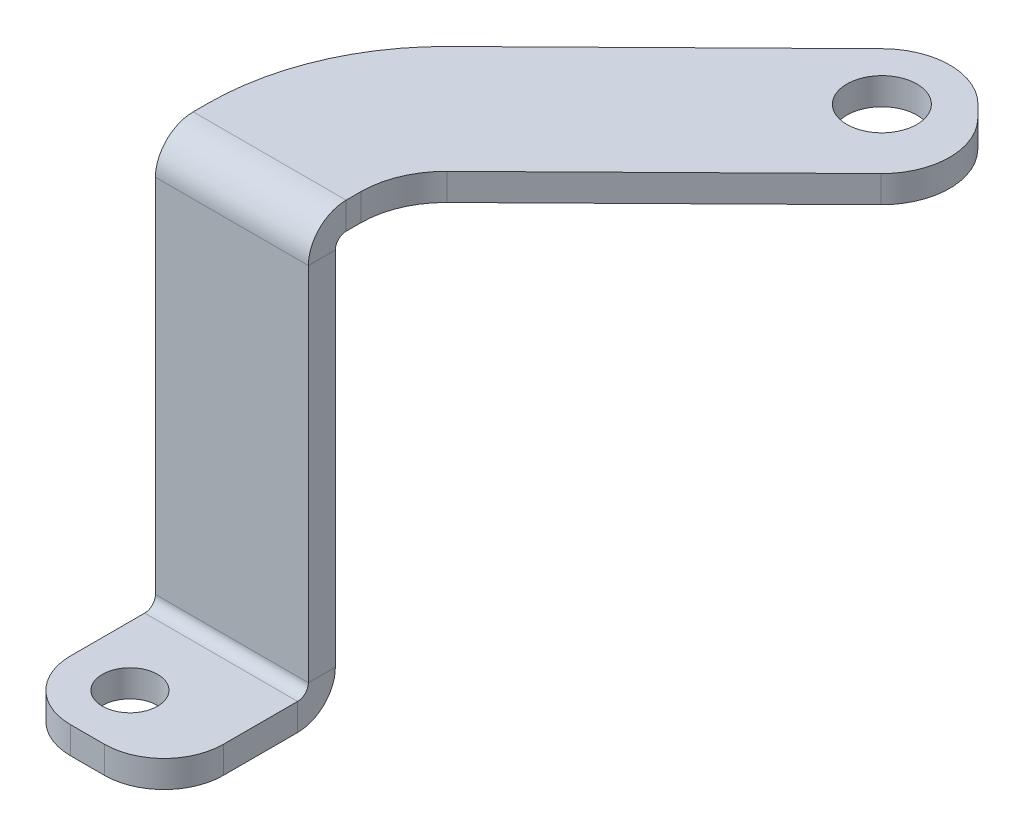
ISO-10303-21;
HEADER;
FILE_DESCRIPTION(('STEP AP214'),'2;1');
FILE_NAME('part.step','',(''),(''),'','','');
FILE_SCHEMA(('AUTOMOTIVE_DESIGN { 1 0 10303 214 1 1 1 1 }'));
ENDSEC;
DATA;
#1=APPLICATION_CONTEXT('core data for automotive mechanical design processes');
#2=APPLICATION_PROTOCOL_DEFINITION('international standard','automotive_design',2000,#1);
#3=PRODUCT_CONTEXT('',#1,'mechanical');
#4=PRODUCT('Part','Part','',(#3));
#5=PRODUCT_RELATED_PRODUCT_CATEGORY('part','',(#4));
#6=PRODUCT_DEFINITION_FORMATION('','',#4);
#7=PRODUCT_DEFINITION_CONTEXT('part definition',#1,'design');
#8=PRODUCT_DEFINITION('design','',#6,#7);
#9=PRODUCT_DEFINITION_SHAPE('','',#8);
#10=(LENGTH_UNIT() NAMED_UNIT(*) SI_UNIT(.MILLI.,.METRE.));
#11=(NAMED_UNIT(*) PLANE_ANGLE_UNIT() SI_UNIT($,.RADIAN.));
#12=(NAMED_UNIT(*) SI_UNIT($,.STERADIAN.) SOLID_ANGLE_UNIT());
#13=UNCERTAINTY_MEASURE_WITH_UNIT(LENGTH_MEASURE(1.E-05),#10,'distance_accuracy_value','');
#14=(GEOMETRIC_REPRESENTATION_CONTEXT(3) GLOBAL_UNCERTAINTY_ASSIGNED_CONTEXT((#13)) GLOBAL_UNIT_ASSIGNED_CONTEXT((#10,
#11,#12)) REPRESENTATION_CONTEXT('',''));
#15=CARTESIAN_POINT('',(0.,0.,0.));
#16=DIRECTION('',(0.,0.,1.));
#17=DIRECTION('',(1.,0.,0.));
#18=AXIS2_PLACEMENT_3D('',#15,#16,#17);
#19=CARTESIAN_POINT('',(11.,0.,-13.175));
#20=DIRECTION('',(-1.,0.,0.));
#21=DIRECTION('',(0.,0.,1.));
#22=AXIS2_PLACEMENT_3D('',#19,#20,#21);
#23=PLANE('',#22);
#24=DIRECTION('',(0.,0.,1.));
#25=VECTOR('',#24,1.);
#26=CARTESIAN_POINT('',(11.,43.7924999999999,-13.1750000000001));
#27=LINE('',#26,#25);
#28=CARTESIAN_POINT('',(11.,43.7924999999999,-13.1750000000001));
#29=VERTEX_POINT('',#28);
#30=CARTESIAN_POINT('',(11.,43.7924999999999,-10.0000000000001));
#31=VERTEX_POINT('',#30);
#32=EDGE_CURVE('E284',#29,#31,#27,.T.);
#33=ORIENTED_EDGE('',*,*,#32,.T.);
#34=DIRECTION('',(0.,-1.,0.));
#35=VECTOR('',#34,1.);
#36=CARTESIAN_POINT('',(11.,0.,-10.));
#37=LINE('',#36,#35);
#38=CARTESIAN_POINT('',(11.,1.26999999999998,-10.));
#39=VERTEX_POINT('',#38);
#40=EDGE_CURVE('E309',#31,#39,#37,.T.);
#41=ORIENTED_EDGE('',*,*,#40,.T.);
#42=DIRECTION('',(0.,0.,-1.));
#43=VECTOR('',#42,1.);
#44=CARTESIAN_POINT('',(11.,1.27,-10.));
#45=LINE('',#44,#43);
#46=CARTESIAN_POINT('',(11.,1.26999999999997,-13.175));
#47=VERTEX_POINT('',#46);
#48=EDGE_CURVE('E296',#39,#47,#45,.T.);
#49=ORIENTED_EDGE('',*,*,#48,.T.);
#50=DIRECTION('',(0.,-1.,0.));
#51=VECTOR('',#50,1.);
#52=CARTESIAN_POINT('',(11.,0.,-13.175));
#53=LINE('',#52,#51);
#54=EDGE_CURVE('E310',#29,#47,#53,.T.);
#55=ORIENTED_EDGE('',*,*,#54,.F.);
#56=EDGE_LOOP('',(#33,#41,#49,#55));
#57=FACE_BOUND('',#56,.T.);
#58=ADVANCED_FACE('F43',(#57),#23,.F.);
#59=CARTESIAN_POINT('',(-6.99999999999999,45.0624999999999,-13.1750000000002));
#60=DIRECTION('',(1.,0.,0.));
#61=DIRECTION('',(0.,1.,0.));
#62=AXIS2_PLACEMENT_3D('',#59,#60,#61);
#63=PLANE('',#62);
#64=DIRECTION('',(0.,0.,1.));
#65=VECTOR('',#64,1.);
#66=CARTESIAN_POINT('',(-6.99999999999999,43.7924999999999,-13.1750000000001));
#67=LINE('',#66,#65);
#68=CARTESIAN_POINT('',(-6.99999999999999,43.7924999999999,-13.1750000000001));
#69=VERTEX_POINT('',#68);
#70=CARTESIAN_POINT('',(-6.99999999999999,43.7924999999999,-10.0000000000002));
#71=VERTEX_POINT('',#70);
#72=EDGE_CURVE('E294',#69,#71,#67,.T.);
#73=ORIENTED_EDGE('',*,*,#72,.F.);
#74=DIRECTION('',(0.,1.,0.));
#75=VECTOR('',#74,1.);
#76=CARTESIAN_POINT('',(-6.99999999999999,45.0624999999999,-13.1750000000002));
#77=LINE('',#76,#75);
#78=CARTESIAN_POINT('',(-7.,1.27000000000002,-13.175));
#79=VERTEX_POINT('',#78);
#80=EDGE_CURVE('E312',#79,#69,#77,.T.);
#81=ORIENTED_EDGE('',*,*,#80,.F.);
#82=DIRECTION('',(0.,0.,-1.));
#83=VECTOR('',#82,1.);
#84=CARTESIAN_POINT('',(-7.,1.27,-10.));
#85=LINE('',#84,#83);
#86=CARTESIAN_POINT('',(-7.,1.26999999999998,-10.));
#87=VERTEX_POINT('',#86);
#88=EDGE_CURVE('E301',#87,#79,#85,.T.);
#89=ORIENTED_EDGE('',*,*,#88,.F.);
#90=DIRECTION('',(0.,1.,0.));
#91=VECTOR('',#90,1.);
#92=CARTESIAN_POINT('',(-6.99999999999999,45.0624999999999,-10.0000000000002));
#93=LINE('',#92,#91);
#94=EDGE_CURVE('E313',#87,#71,#93,.T.);
#95=ORIENTED_EDGE('',*,*,#94,.T.);
#96=EDGE_LOOP('',(#73,#81,#89,#95));
#97=FACE_BOUND('',#96,.T.);
#98=ADVANCED_FACE('F417',(#97),#63,.F.);
#99=CARTESIAN_POINT('',(0.,0.,-13.175));
#100=DIRECTION('',(0.,0.,1.));
#101=DIRECTION('',(0.,-1.,0.));
#102=AXIS2_PLACEMENT_3D('',#99,#100,#101);
#103=PLANE('',#102);
#104=DIRECTION('',(1.,0.,0.));
#105=VECTOR('',#104,1.);
#106=CARTESIAN_POINT('',(11.,43.7924999999999,-13.1750000000001));
#107=LINE('',#106,#105);
#108=EDGE_CURVE('E290',#29,#69,#107,.F.);
#109=ORIENTED_EDGE('',*,*,#108,.F.);
#110=ORIENTED_EDGE('',*,*,#54,.T.);
#111=DIRECTION('',(1.,0.,0.));
#112=VECTOR('',#111,1.);
#113=CARTESIAN_POINT('',(0.,1.27000000000002,-13.175));
#114=LINE('',#113,#112);
#115=EDGE_CURVE('E304',#79,#47,#114,.T.);
#116=ORIENTED_EDGE('',*,*,#115,.F.);
#117=ORIENTED_EDGE('',*,*,#80,.T.);
#118=EDGE_LOOP('',(#109,#110,#116,#117));
#119=FACE_BOUND('',#118,.T.);
#120=ADVANCED_FACE('F420',(#119),#103,.F.);
#121=CARTESIAN_POINT('',(0.,0.,-10.));
#122=DIRECTION('',(0.,0.,1.));
#123=DIRECTION('',(0.,-1.,0.));
#124=AXIS2_PLACEMENT_3D('',#121,#122,#123);
#125=PLANE('',#124);
#126=ORIENTED_EDGE('',*,*,#40,.F.);
#127=DIRECTION('',(1.,0.,0.));
#128=VECTOR('',#127,1.);
#129=CARTESIAN_POINT('',(11.,43.7924999999999,-10.0000000000001));
#130=LINE('',#129,#128);
#131=EDGE_CURVE('E279',#31,#71,#130,.F.);
#132=ORIENTED_EDGE('',*,*,#131,.T.);
#133=ORIENTED_EDGE('',*,*,#94,.F.);
#134=DIRECTION('',(-1.,0.,0.));
#135=VECTOR('',#134,1.);
#136=CARTESIAN_POINT('',(11.,1.27,-10.));
#137=LINE('',#136,#135);
#138=EDGE_CURVE('E299',#39,#87,#137,.T.);
#139=ORIENTED_EDGE('',*,*,#138,.F.);
#140=EDGE_LOOP('',(#126,#132,#133,#139));
#141=FACE_BOUND('',#140,.T.);
#142=ADVANCED_FACE('F408',(#141),#125,.T.);
#143=CARTESIAN_POINT('',(-7.,-3.175,-10.));
#144=DIRECTION('',(-1.,0.,0.));
#145=DIRECTION('',(0.,0.,1.));
#146=AXIS2_PLACEMENT_3D('',#143,#144,#145);
#147=PLANE('',#146);
#148=DIRECTION('',(0.,0.,1.));
#149=VECTOR('',#148,1.);
#150=CARTESIAN_POINT('',(-7.,0.,-10.));
#151=LINE('',#150,#149);
#152=CARTESIAN_POINT('',(-7.,0.,-8.73000000000001));
#153=VERTEX_POINT('',#152);
#154=CARTESIAN_POINT('',(-7.,0.,0.));
#155=VERTEX_POINT('',#154);
#156=EDGE_CURVE('E344',#153,#155,#151,.T.);
#157=ORIENTED_EDGE('',*,*,#156,.F.);
#158=DIRECTION('',(0.,-1.,0.));
#159=VECTOR('',#158,1.);
#160=CARTESIAN_POINT('',(-7.,0.,-8.73000000000001));
#161=LINE('',#160,#159);
#162=CARTESIAN_POINT('',(-7.,-3.17500000000002,-8.73000000000001));
#163=VERTEX_POINT('',#162);
#164=EDGE_CURVE('E326',#153,#163,#161,.T.);
#165=ORIENTED_EDGE('',*,*,#164,.T.);
#166=DIRECTION('',(0.,0.,1.));
#167=VECTOR('',#166,1.);
#168=CARTESIAN_POINT('',(-7.,-3.175,-10.));
#169=LINE('',#168,#167);
#170=CARTESIAN_POINT('',(-7.,-3.175,0.));
#171=VERTEX_POINT('',#170);
#172=EDGE_CURVE('E347',#163,#171,#169,.T.);
#173=ORIENTED_EDGE('',*,*,#172,.T.);
#174=DIRECTION('',(0.,1.,0.));
#175=VECTOR('',#174,1.);
#176=CARTESIAN_POINT('',(-7.,-3.175,0.));
#177=LINE('',#176,#175);
#178=EDGE_CURVE('E47',#171,#155,#177,.T.);
#179=ORIENTED_EDGE('',*,*,#178,.T.);
#180=EDGE_LOOP('',(#157,#165,#173,#179));
#181=FACE_BOUND('',#180,.T.);
#182=ADVANCED_FACE('F45',(#181),#147,.T.);
#183=CARTESIAN_POINT('',(0.,-3.175,0.));
#184=DIRECTION('',(0.,1.,0.));
#185=DIRECTION('',(0.,0.,1.));
#186=AXIS2_PLACEMENT_3D('',#183,#184,#185);
#187=PLANE('',#186);
#188=CARTESIAN_POINT('',(0.,-3.175,0.));
#189=DIRECTION('',(0.,1.,0.));
#190=DIRECTION('',(0.,0.,1.));
#191=AXIS2_PLACEMENT_3D('',#188,#189,#190);
#192=CIRCLE('',#191,3.25);
#193=CARTESIAN_POINT('',(0.,-3.175,3.25));
#194=VERTEX_POINT('',#193);
#195=EDGE_CURVE('E341',#194,#194,#192,.T.);
#196=ORIENTED_EDGE('',*,*,#195,.T.);
#197=EDGE_LOOP('',(#196));
#198=FACE_BOUND('',#197,.T.);
#199=DIRECTION('',(-1.,0.,0.));
#200=VECTOR('',#199,1.);
#201=CARTESIAN_POINT('',(-7.,-3.17500000000002,-8.73000000000001));
#202=LINE('',#201,#200);
#203=CARTESIAN_POINT('',(11.,-3.175,-8.73000000000001));
#204=VERTEX_POINT('',#203);
#205=EDGE_CURVE('E320',#163,#204,#202,.F.);
#206=ORIENTED_EDGE('',*,*,#205,.T.);
#207=DIRECTION('',(0.,0.,-1.));
#208=VECTOR('',#207,1.);
#209=CARTESIAN_POINT('',(11.,-3.175,0.));
#210=LINE('',#209,#208);
#211=CARTESIAN_POINT('',(11.,-3.175,0.));
#212=VERTEX_POINT('',#211);
#213=EDGE_CURVE('E359',#212,#204,#210,.T.);
#214=ORIENTED_EDGE('',*,*,#213,.F.);
#215=CARTESIAN_POINT('',(4.,-3.175,0.));
#216=DIRECTION('',(0.,1.,0.));
#217=DIRECTION('',(0.,0.,1.));
#218=AXIS2_PLACEMENT_3D('',#215,#216,#217);
#219=CIRCLE('',#218,7.);
#220=CARTESIAN_POINT('',(4.,-3.175,7.));
#221=VERTEX_POINT('',#220);
#222=EDGE_CURVE('E356',#221,#212,#219,.T.);
#223=ORIENTED_EDGE('',*,*,#222,.F.);
#224=DIRECTION('',(1.,0.,0.));
#225=VECTOR('',#224,1.);
#226=CARTESIAN_POINT('',(0.,-3.175,7.));
#227=LINE('',#226,#225);
#228=CARTESIAN_POINT('',(0.,-3.175,7.));
#229=VERTEX_POINT('',#228);
#230=EDGE_CURVE('E353',#229,#221,#227,.T.);
#231=ORIENTED_EDGE('',*,*,#230,.F.);
#232=CARTESIAN_POINT('',(0.,-3.175,0.));
#233=DIRECTION('',(0.,1.,0.));
#234=DIRECTION('',(0.,0.,1.));
#235=AXIS2_PLACEMENT_3D('',#232,#233,#234);
#236=CIRCLE('',#235,7.);
#237=EDGE_CURVE('E349',#171,#229,#236,.T.);
#238=ORIENTED_EDGE('',*,*,#237,.F.);
#239=ORIENTED_EDGE('',*,*,#172,.F.);
#240=EDGE_LOOP('',(#206,#214,#223,#231,#238,#239));
#241=FACE_BOUND('',#240,.T.);
#242=ADVANCED_FACE('F425',(#198,#241),#187,.F.);
#243=CARTESIAN_POINT('',(0.,0.,0.));
#244=DIRECTION('',(0.,1.,0.));
#245=DIRECTION('',(0.,0.,1.));
#246=AXIS2_PLACEMENT_3D('',#243,#244,#245);
#247=PLANE('',#246);
#248=CARTESIAN_POINT('',(0.,0.,0.));
#249=DIRECTION('',(0.,1.,0.));
#250=DIRECTION('',(0.,0.,1.));
#251=AXIS2_PLACEMENT_3D('',#248,#249,#250);
#252=CIRCLE('',#251,3.25);
#253=CARTESIAN_POINT('',(0.,0.,3.25));
#254=VERTEX_POINT('',#253);
#255=EDGE_CURVE('E338',#254,#254,#252,.T.);
#256=ORIENTED_EDGE('',*,*,#255,.F.);
#257=EDGE_LOOP('',(#256));
#258=FACE_BOUND('',#257,.T.);
#259=DIRECTION('',(0.,0.,-1.));
#260=VECTOR('',#259,1.);
#261=CARTESIAN_POINT('',(11.,0.,0.));
#262=LINE('',#261,#260);
#263=CARTESIAN_POINT('',(11.,0.,0.));
#264=VERTEX_POINT('',#263);
#265=CARTESIAN_POINT('',(11.,0.,-8.73000000000001));
#266=VERTEX_POINT('',#265);
#267=EDGE_CURVE('E350',#264,#266,#262,.T.);
#268=ORIENTED_EDGE('',*,*,#267,.T.);
#269=DIRECTION('',(-1.,0.,0.));
#270=VECTOR('',#269,1.);
#271=CARTESIAN_POINT('',(-7.,0.,-8.73000000000001));
#272=LINE('',#271,#270);
#273=EDGE_CURVE('E68',#153,#266,#272,.F.);
#274=ORIENTED_EDGE('',*,*,#273,.F.);
#275=ORIENTED_EDGE('',*,*,#156,.T.);
#276=CARTESIAN_POINT('',(0.,0.,0.));
#277=DIRECTION('',(0.,1.,0.));
#278=DIRECTION('',(0.,0.,1.));
#279=AXIS2_PLACEMENT_3D('',#276,#277,#278);
#280=CIRCLE('',#279,7.);
#281=CARTESIAN_POINT('',(0.,0.,7.));
#282=VERTEX_POINT('',#281);
#283=EDGE_CURVE('E363',#155,#282,#280,.T.);
#284=ORIENTED_EDGE('',*,*,#283,.T.);
#285=DIRECTION('',(1.,0.,0.));
#286=VECTOR('',#285,1.);
#287=CARTESIAN_POINT('',(0.,0.,7.));
#288=LINE('',#287,#286);
#289=CARTESIAN_POINT('',(4.,0.,7.));
#290=VERTEX_POINT('',#289);
#291=EDGE_CURVE('E366',#282,#290,#288,.T.);
#292=ORIENTED_EDGE('',*,*,#291,.T.);
#293=CARTESIAN_POINT('',(4.,0.,0.));
#294=DIRECTION('',(0.,1.,0.));
#295=DIRECTION('',(0.,0.,1.));
#296=AXIS2_PLACEMENT_3D('',#293,#294,#295);
#297=CIRCLE('',#296,7.);
#298=EDGE_CURVE('E369',#290,#264,#297,.T.);
#299=ORIENTED_EDGE('',*,*,#298,.T.);
#300=EDGE_LOOP('',(#268,#274,#275,#284,#292,#299));
#301=FACE_BOUND('',#300,.T.);
#302=ADVANCED_FACE('F383',(#258,#301),#247,.T.);
#303=CARTESIAN_POINT('',(11.,-3.175,0.));
#304=DIRECTION('',(1.,0.,0.));
#305=DIRECTION('',(0.,0.,-1.));
#306=AXIS2_PLACEMENT_3D('',#303,#304,#305);
#307=PLANE('',#306);
#308=DIRECTION('',(0.,-1.,0.));
#309=VECTOR('',#308,1.);
#310=CARTESIAN_POINT('',(11.,0.,-8.73000000000001));
#311=LINE('',#310,#309);
#312=EDGE_CURVE('E335',#266,#204,#311,.T.);
#313=ORIENTED_EDGE('',*,*,#312,.F.);
#314=ORIENTED_EDGE('',*,*,#267,.F.);
#315=DIRECTION('',(0.,1.,0.));
#316=VECTOR('',#315,1.);
#317=CARTESIAN_POINT('',(11.,-3.175,0.));
#318=LINE('',#317,#316);
#319=EDGE_CURVE('E11',#212,#264,#318,.T.);
#320=ORIENTED_EDGE('',*,*,#319,.F.);
#321=ORIENTED_EDGE('',*,*,#213,.T.);
#322=EDGE_LOOP('',(#313,#314,#320,#321));
#323=FACE_BOUND('',#322,.T.);
#324=ADVANCED_FACE('F394',(#323),#307,.T.);
#325=CARTESIAN_POINT('',(4.,-3.175,0.));
#326=DIRECTION('',(0.,1.,0.));
#327=DIRECTION('',(0.,0.,1.));
#328=AXIS2_PLACEMENT_3D('',#325,#326,#327);
#329=CYLINDRICAL_SURFACE('',#328,7.);
#330=ORIENTED_EDGE('',*,*,#298,.F.);
#331=DIRECTION('',(0.,1.,0.));
#332=VECTOR('',#331,1.);
#333=CARTESIAN_POINT('',(4.,-3.175,7.));
#334=LINE('',#333,#332);
#335=EDGE_CURVE('E52',#221,#290,#334,.T.);
#336=ORIENTED_EDGE('',*,*,#335,.F.);
#337=ORIENTED_EDGE('',*,*,#222,.T.);
#338=ORIENTED_EDGE('',*,*,#319,.T.);
#339=EDGE_LOOP('',(#330,#336,#337,#338));
#340=FACE_BOUND('',#339,.T.);
#341=ADVANCED_FACE('F391',(#340),#329,.T.);
#342=CARTESIAN_POINT('',(0.,-3.175,7.));
#343=DIRECTION('',(0.,0.,1.));
#344=DIRECTION('',(1.,0.,0.));
#345=AXIS2_PLACEMENT_3D('',#342,#343,#344);
#346=PLANE('',#345);
#347=ORIENTED_EDGE('',*,*,#291,.F.);
#348=DIRECTION('',(0.,1.,0.));
#349=VECTOR('',#348,1.);
#350=CARTESIAN_POINT('',(0.,-3.175,7.));
#351=LINE('',#350,#349);
#352=EDGE_CURVE('E373',#229,#282,#351,.T.);
#353=ORIENTED_EDGE('',*,*,#352,.F.);
#354=ORIENTED_EDGE('',*,*,#230,.T.);
#355=ORIENTED_EDGE('',*,*,#335,.T.);
#356=EDGE_LOOP('',(#347,#353,#354,#355));
#357=FACE_BOUND('',#356,.T.);
#358=ADVANCED_FACE('F387',(#357),#346,.T.);
#359=CARTESIAN_POINT('',(0.,-3.175,0.));
#360=DIRECTION('',(0.,1.,0.));
#361=DIRECTION('',(0.,0.,1.));
#362=AXIS2_PLACEMENT_3D('',#359,#360,#361);
#363=CYLINDRICAL_SURFACE('',#362,7.);
#364=ORIENTED_EDGE('',*,*,#283,.F.);
#365=ORIENTED_EDGE('',*,*,#178,.F.);
#366=ORIENTED_EDGE('',*,*,#237,.T.);
#367=ORIENTED_EDGE('',*,*,#352,.T.);
#368=EDGE_LOOP('',(#364,#365,#366,#367));
#369=FACE_BOUND('',#368,.T.);
#370=ADVANCED_FACE('F382',(#369),#363,.T.);
#371=CARTESIAN_POINT('',(0.,-3.175,0.));
#372=DIRECTION('',(0.,1.,0.));
#373=DIRECTION('',(0.,0.,1.));
#374=AXIS2_PLACEMENT_3D('',#371,#372,#373);
#375=CYLINDRICAL_SURFACE('',#374,3.25);
#376=ORIENTED_EDGE('',*,*,#195,.F.);
#377=EDGE_LOOP('',(#376));
#378=FACE_BOUND('',#377,.T.);
#379=ORIENTED_EDGE('',*,*,#255,.T.);
#380=EDGE_LOOP('',(#379));
#381=FACE_BOUND('',#380,.T.);
#382=ADVANCED_FACE('F451',(#378,#381),#375,.F.);
#383=CARTESIAN_POINT('',(11.,1.26999999999999,-8.73000000000001));
#384=DIRECTION('',(1.,0.,0.));
#385=DIRECTION('',(0.,0.,-1.));
#386=AXIS2_PLACEMENT_3D('',#383,#384,#385);
#387=PLANE('',#386);
#388=ORIENTED_EDGE('',*,*,#48,.F.);
#389=CARTESIAN_POINT('',(11.,1.26999999999999,-8.73000000000001));
#390=DIRECTION('',(-1.,0.,0.));
#391=DIRECTION('',(0.,0.,1.));
#392=AXIS2_PLACEMENT_3D('',#389,#390,#391);
#393=CIRCLE('',#392,1.27);
#394=EDGE_CURVE('E329',#266,#39,#393,.F.);
#395=ORIENTED_EDGE('',*,*,#394,.F.);
#396=ORIENTED_EDGE('',*,*,#312,.T.);
#397=CARTESIAN_POINT('',(11.,1.26999999999999,-8.73000000000001));
#398=DIRECTION('',(-1.,0.,0.));
#399=DIRECTION('',(0.,0.,1.));
#400=AXIS2_PLACEMENT_3D('',#397,#398,#399);
#401=CIRCLE('',#400,4.445);
#402=EDGE_CURVE('E322',#204,#47,#401,.F.);
#403=ORIENTED_EDGE('',*,*,#402,.T.);
#404=EDGE_LOOP('',(#388,#395,#396,#403));
#405=FACE_BOUND('',#404,.T.);
#406=ADVANCED_FACE('F402',(#405),#387,.T.);
#407=CARTESIAN_POINT('',(-7.,1.26999999999999,-8.73000000000001));
#408=DIRECTION('',(1.,0.,0.));
#409=DIRECTION('',(0.,0.,-1.));
#410=AXIS2_PLACEMENT_3D('',#407,#408,#409);
#411=PLANE('',#410);
#412=CARTESIAN_POINT('',(-7.,1.26999999999999,-8.73000000000001));
#413=DIRECTION('',(-1.,0.,0.));
#414=DIRECTION('',(0.,0.,1.));
#415=AXIS2_PLACEMENT_3D('',#412,#413,#414);
#416=CIRCLE('',#415,1.27);
#417=EDGE_CURVE('E316',#87,#153,#416,.T.);
#418=ORIENTED_EDGE('',*,*,#417,.F.);
#419=ORIENTED_EDGE('',*,*,#88,.T.);
#420=CARTESIAN_POINT('',(-7.,1.26999999999999,-8.73000000000001));
#421=DIRECTION('',(-1.,0.,0.));
#422=DIRECTION('',(0.,0.,1.));
#423=AXIS2_PLACEMENT_3D('',#420,#421,#422);
#424=CIRCLE('',#423,4.445);
#425=EDGE_CURVE('E323',#79,#163,#424,.T.);
#426=ORIENTED_EDGE('',*,*,#425,.T.);
#427=ORIENTED_EDGE('',*,*,#164,.F.);
#428=EDGE_LOOP('',(#418,#419,#426,#427));
#429=FACE_BOUND('',#428,.T.);
#430=ADVANCED_FACE('F412',(#429),#411,.F.);
#431=CARTESIAN_POINT('',(-7.,1.26999999999999,-8.73000000000001));
#432=DIRECTION('',(-1.,0.,0.));
#433=DIRECTION('',(0.,0.,-1.));
#434=AXIS2_PLACEMENT_3D('',#431,#432,#433);
#435=CYLINDRICAL_SURFACE('',#434,4.445);
#436=ORIENTED_EDGE('',*,*,#205,.F.);
#437=ORIENTED_EDGE('',*,*,#425,.F.);
#438=ORIENTED_EDGE('',*,*,#115,.T.);
#439=ORIENTED_EDGE('',*,*,#402,.F.);
#440=EDGE_LOOP('',(#436,#437,#438,#439));
#441=FACE_BOUND('',#440,.T.);
#442=ADVANCED_FACE('F423',(#441),#435,.T.);
#443=CARTESIAN_POINT('',(-7.,1.26999999999999,-8.73000000000001));
#444=DIRECTION('',(-1.,0.,0.));
#445=DIRECTION('',(0.,0.,-1.));
#446=AXIS2_PLACEMENT_3D('',#443,#444,#445);
#447=CYLINDRICAL_SURFACE('',#446,1.27);
#448=ORIENTED_EDGE('',*,*,#273,.T.);
#449=ORIENTED_EDGE('',*,*,#394,.T.);
#450=ORIENTED_EDGE('',*,*,#138,.T.);
#451=ORIENTED_EDGE('',*,*,#417,.T.);
#452=EDGE_LOOP('',(#448,#449,#450,#451));
#453=FACE_BOUND('',#452,.T.);
#454=ADVANCED_FACE('F397',(#453),#447,.F.);
#455=CARTESIAN_POINT('',(-6.99999999999999,43.7924999999999,-14.4450000000001));
#456=DIRECTION('',(-1.,0.,0.));
#457=DIRECTION('',(0.,0.,1.));
#458=AXIS2_PLACEMENT_3D('',#455,#456,#457);
#459=PLANE('',#458);
#460=DIRECTION('',(0.,1.,0.));
#461=VECTOR('',#460,1.);
#462=CARTESIAN_POINT('',(-7.,45.0624999999999,-14.4450000000001));
#463=LINE('',#462,#461);
#464=CARTESIAN_POINT('',(-6.99999999999999,45.0624999999999,-14.4450000000001));
#465=VERTEX_POINT('',#464);
#466=CARTESIAN_POINT('',(-6.99999999999999,48.2374999999999,-14.4450000000001));
#467=VERTEX_POINT('',#466);
#468=EDGE_CURVE('E248',#465,#467,#463,.T.);
#469=ORIENTED_EDGE('',*,*,#468,.F.);
#470=CARTESIAN_POINT('',(-6.99999999999999,43.7924999999999,-14.4450000000001));
#471=DIRECTION('',(1.,0.,0.));
#472=DIRECTION('',(0.,0.,-1.));
#473=AXIS2_PLACEMENT_3D('',#470,#471,#472);
#474=CIRCLE('',#473,1.27);
#475=EDGE_CURVE('E287',#69,#465,#474,.F.);
#476=ORIENTED_EDGE('',*,*,#475,.F.);
#477=ORIENTED_EDGE('',*,*,#72,.T.);
#478=CARTESIAN_POINT('',(-6.99999999999999,43.7924999999999,-14.4450000000001));
#479=DIRECTION('',(1.,0.,0.));
#480=DIRECTION('',(0.,0.,-1.));
#481=AXIS2_PLACEMENT_3D('',#478,#479,#480);
#482=CIRCLE('',#481,4.445);
#483=EDGE_CURVE('E60',#71,#467,#482,.F.);
#484=ORIENTED_EDGE('',*,*,#483,.T.);
#485=EDGE_LOOP('',(#469,#476,#477,#484));
#486=FACE_BOUND('',#485,.T.);
#487=ADVANCED_FACE('F448',(#486),#459,.T.);
#488=CARTESIAN_POINT('',(11.,43.7924999999999,-14.4450000000001));
#489=DIRECTION('',(-1.,0.,0.));
#490=DIRECTION('',(0.,0.,1.));
#491=AXIS2_PLACEMENT_3D('',#488,#489,#490);
#492=PLANE('',#491);
#493=CARTESIAN_POINT('',(11.,43.7924999999999,-14.4450000000001));
#494=DIRECTION('',(1.,0.,0.));
#495=DIRECTION('',(0.,0.,-1.));
#496=AXIS2_PLACEMENT_3D('',#493,#494,#495);
#497=CIRCLE('',#496,1.27);
#498=CARTESIAN_POINT('',(11.,45.0624999999999,-14.4450000000001));
#499=VERTEX_POINT('',#498);
#500=EDGE_CURVE('E278',#499,#29,#497,.T.);
#501=ORIENTED_EDGE('',*,*,#500,.F.);
#502=DIRECTION('',(0.,1.,0.));
#503=VECTOR('',#502,1.);
#504=CARTESIAN_POINT('',(11.,45.0624999999999,-14.4450000000001));
#505=LINE('',#504,#503);
#506=CARTESIAN_POINT('',(11.,48.2374999999999,-14.4450000000001));
#507=VERTEX_POINT('',#506);
#508=EDGE_CURVE('E258',#499,#507,#505,.T.);
#509=ORIENTED_EDGE('',*,*,#508,.T.);
#510=CARTESIAN_POINT('',(11.,43.7924999999999,-14.4450000000001));
#511=DIRECTION('',(1.,0.,0.));
#512=DIRECTION('',(0.,0.,-1.));
#513=AXIS2_PLACEMENT_3D('',#510,#511,#512);
#514=CIRCLE('',#513,4.445);
#515=EDGE_CURVE('E282',#507,#31,#514,.T.);
#516=ORIENTED_EDGE('',*,*,#515,.T.);
#517=ORIENTED_EDGE('',*,*,#32,.F.);
#518=EDGE_LOOP('',(#501,#509,#516,#517));
#519=FACE_BOUND('',#518,.T.);
#520=ADVANCED_FACE('F532',(#519),#492,.F.);
#521=CARTESIAN_POINT('',(11.,43.7924999999999,-14.4450000000001));
#522=DIRECTION('',(1.,0.,0.));
#523=DIRECTION('',(0.,1.,0.));
#524=AXIS2_PLACEMENT_3D('',#521,#522,#523);
#525=CYLINDRICAL_SURFACE('',#524,4.445);
#526=ORIENTED_EDGE('',*,*,#131,.F.);
#527=ORIENTED_EDGE('',*,*,#515,.F.);
#528=DIRECTION('',(-1.,0.,0.));
#529=VECTOR('',#528,1.);
#530=CARTESIAN_POINT('',(0.,48.2374999999999,-14.4450000000001));
#531=LINE('',#530,#529);
#532=EDGE_CURVE('E261',#507,#467,#531,.T.);
#533=ORIENTED_EDGE('',*,*,#532,.T.);
#534=ORIENTED_EDGE('',*,*,#483,.F.);
#535=EDGE_LOOP('',(#526,#527,#533,#534));
#536=FACE_BOUND('',#535,.T.);
#537=ADVANCED_FACE('F543',(#536),#525,.T.);
#538=CARTESIAN_POINT('',(11.,43.7924999999999,-14.4450000000001));
#539=DIRECTION('',(1.,0.,0.));
#540=DIRECTION('',(0.,1.,0.));
#541=AXIS2_PLACEMENT_3D('',#538,#539,#540);
#542=CYLINDRICAL_SURFACE('',#541,1.27);
#543=ORIENTED_EDGE('',*,*,#108,.T.);
#544=ORIENTED_EDGE('',*,*,#475,.T.);
#545=DIRECTION('',(1.,0.,0.));
#546=VECTOR('',#545,1.);
#547=CARTESIAN_POINT('',(-7.,45.0624999999999,-14.4450000000001));
#548=LINE('',#547,#546);
#549=EDGE_CURVE('E256',#465,#499,#548,.T.);
#550=ORIENTED_EDGE('',*,*,#549,.T.);
#551=ORIENTED_EDGE('',*,*,#500,.T.);
#552=EDGE_LOOP('',(#543,#544,#550,#551));
#553=FACE_BOUND('',#552,.T.);
#554=ADVANCED_FACE('F554',(#553),#542,.F.);
#555=CARTESIAN_POINT('',(-6.99999999999999,48.2374999999999,-13.1750000000002));
#556=DIRECTION('',(1.,0.,0.));
#557=DIRECTION('',(0.,0.,-1.));
#558=AXIS2_PLACEMENT_3D('',#555,#556,#557);
#559=PLANE('',#558);
#560=ORIENTED_EDGE('',*,*,#468,.T.);
#561=DIRECTION('',(0.,0.,1.));
#562=VECTOR('',#561,1.);
#563=CARTESIAN_POINT('',(-6.99999999999999,48.2374999999999,-13.1750000000002));
#564=LINE('',#563,#562);
#565=CARTESIAN_POINT('',(-7.,48.2374999999999,-16.1750000000002));
#566=VERTEX_POINT('',#565);
#567=EDGE_CURVE('E266',#566,#467,#564,.T.);
#568=ORIENTED_EDGE('',*,*,#567,.F.);
#569=DIRECTION('',(0.,-1.,0.));
#570=VECTOR('',#569,1.);
#571=CARTESIAN_POINT('',(-7.,48.2374999999999,-16.1750000000002));
#572=LINE('',#571,#570);
#573=CARTESIAN_POINT('',(-7.,45.0624999999999,-16.1750000000002));
#574=VERTEX_POINT('',#573);
#575=EDGE_CURVE('E272',#566,#574,#572,.T.);
#576=ORIENTED_EDGE('',*,*,#575,.T.);
#577=DIRECTION('',(0.,0.,1.));
#578=VECTOR('',#577,1.);
#579=CARTESIAN_POINT('',(-6.99999999999999,45.0624999999999,-13.1750000000002));
#580=LINE('',#579,#578);
#581=EDGE_CURVE('E265',#574,#465,#580,.T.);
#582=ORIENTED_EDGE('',*,*,#581,.T.);
#583=EDGE_LOOP('',(#560,#568,#576,#582));
#584=FACE_BOUND('',#583,.T.);
#585=ADVANCED_FACE('F564',(#584),#559,.F.);
#586=CARTESIAN_POINT('',(11.,48.2374999999999,-16.1750000000002));
#587=DIRECTION('',(-1.,0.,0.));
#588=DIRECTION('',(0.,-1.,0.));
#589=AXIS2_PLACEMENT_3D('',#586,#587,#588);
#590=PLANE('',#589);
#591=ORIENTED_EDGE('',*,*,#508,.F.);
#592=DIRECTION('',(0.,0.,-1.));
#593=VECTOR('',#592,1.);
#594=CARTESIAN_POINT('',(11.,45.0624999999999,-16.1750000000002));
#595=LINE('',#594,#593);
#596=CARTESIAN_POINT('',(11.,45.0624999999999,-16.1750000000001));
#597=VERTEX_POINT('',#596);
#598=EDGE_CURVE('E270',#499,#597,#595,.T.);
#599=ORIENTED_EDGE('',*,*,#598,.T.);
#600=DIRECTION('',(0.,-1.,0.));
#601=VECTOR('',#600,1.);
#602=CARTESIAN_POINT('',(11.,48.2374999999999,-16.1750000000002));
#603=LINE('',#602,#601);
#604=CARTESIAN_POINT('',(11.,48.2374999999999,-16.1750000000002));
#605=VERTEX_POINT('',#604);
#606=EDGE_CURVE('E209',#605,#597,#603,.T.);
#607=ORIENTED_EDGE('',*,*,#606,.F.);
#608=DIRECTION('',(0.,0.,-1.));
#609=VECTOR('',#608,1.);
#610=CARTESIAN_POINT('',(11.,48.2374999999999,-16.1750000000002));
#611=LINE('',#610,#609);
#612=EDGE_CURVE('E269',#507,#605,#611,.T.);
#613=ORIENTED_EDGE('',*,*,#612,.F.);
#614=EDGE_LOOP('',(#591,#599,#607,#613));
#615=FACE_BOUND('',#614,.T.);
#616=ADVANCED_FACE('F575',(#615),#590,.F.);
#617=CARTESIAN_POINT('',(0.,48.2374999999999,0.));
#618=DIRECTION('',(0.,-1.,0.));
#619=DIRECTION('',(0.,0.,-1.));
#620=AXIS2_PLACEMENT_3D('',#617,#618,#619);
#621=PLANE('',#620);
#622=ORIENTED_EDGE('',*,*,#532,.F.);
#623=ORIENTED_EDGE('',*,*,#612,.T.);
#624=CARTESIAN_POINT('',(21.,48.2374999999999,-16.1750000000001));
#625=DIRECTION('',(0.,-1.,0.));
#626=DIRECTION('',(0.,0.,1.));
#627=AXIS2_PLACEMENT_3D('',#624,#625,#626);
#628=CIRCLE('',#627,10.);
#629=CARTESIAN_POINT('',(13.9926432275519,48.2374999999999,-23.30920991166));
#630=VERTEX_POINT('',#629);
#631=EDGE_CURVE('E231',#605,#630,#628,.T.);
#632=ORIENTED_EDGE('',*,*,#631,.T.);
#633=DIRECTION('',(0.713420991165988,0.,-0.700735677244807));
#634=VECTOR('',#633,1.);
#635=CARTESIAN_POINT('',(39.7573464237551,48.2374999999999,-48.6157918131761));
#636=LINE('',#635,#634);
#637=CARTESIAN_POINT('',(39.7573464237551,48.2374999999999,-48.6157918131761));
#638=VERTEX_POINT('',#637);
#639=EDGE_CURVE('E187',#630,#638,#636,.T.);
#640=ORIENTED_EDGE('',*,*,#639,.T.);
#641=CARTESIAN_POINT('',(34.1514610057966,48.2374999999999,-54.323159742504));
#642=DIRECTION('',(0.,1.,0.));
#643=DIRECTION('',(0.,0.,-1.));
#644=AXIS2_PLACEMENT_3D('',#641,#642,#643);
#645=CIRCLE('',#644,8.);
#646=CARTESIAN_POINT('',(39.8588289351245,48.2374999999999,-59.9290451604625));
#647=VERTEX_POINT('',#646);
#648=EDGE_CURVE('E235',#638,#647,#645,.T.);
#649=ORIENTED_EDGE('',*,*,#648,.T.);
#650=DIRECTION('',(-0.700735677244807,0.,-0.713420991165989));
#651=VECTOR('',#650,1.);
#652=CARTESIAN_POINT('',(38.4573575806349,48.2374999999999,-61.3558871427945));
#653=LINE('',#652,#651);
#654=CARTESIAN_POINT('',(38.4573575806349,48.2374999999999,-61.3558871427945));
#655=VERTEX_POINT('',#654);
#656=EDGE_CURVE('E238',#647,#655,#653,.T.);
#657=ORIENTED_EDGE('',*,*,#656,.T.);
#658=CARTESIAN_POINT('',(32.749989651307,48.2374999999999,-55.750001724836));
#659=DIRECTION('',(0.,1.,0.));
#660=DIRECTION('',(0.,0.,-1.));
#661=AXIS2_PLACEMENT_3D('',#658,#659,#660);
#662=CIRCLE('',#661,8.);
#663=CARTESIAN_POINT('',(27.1441042333485,48.2374999999999,-61.4573696541639));
#664=VERTEX_POINT('',#663);
#665=EDGE_CURVE('E241',#655,#664,#662,.T.);
#666=ORIENTED_EDGE('',*,*,#665,.T.);
#667=DIRECTION('',(-0.713420991165988,0.,0.700735677244807));
#668=VECTOR('',#667,1.);
#669=CARTESIAN_POINT('',(1.37940103714539,48.2374999999999,-36.1507877526478));
#670=LINE('',#669,#668);
#671=CARTESIAN_POINT('',(1.37940103714539,48.2374999999999,-36.1507877526478));
#672=VERTEX_POINT('',#671);
#673=EDGE_CURVE('E213',#664,#672,#670,.T.);
#674=ORIENTED_EDGE('',*,*,#673,.T.);
#675=CARTESIAN_POINT('',(21.,48.2374999999999,-16.1750000000001));
#676=DIRECTION('',(0.,1.,0.));
#677=DIRECTION('',(0.,0.,-1.));
#678=AXIS2_PLACEMENT_3D('',#675,#676,#677);
#679=CIRCLE('',#678,28.);
#680=EDGE_CURVE('E210',#672,#566,#679,.T.);
#681=ORIENTED_EDGE('',*,*,#680,.T.);
#682=ORIENTED_EDGE('',*,*,#567,.T.);
#683=EDGE_LOOP('',(#622,#623,#632,#640,#649,#657,#666,#674,#681,#682));
#684=FACE_BOUND('',#683,.T.);
#685=CARTESIAN_POINT('',(32.749989651307,48.2374999999999,-55.750001724836));
#686=DIRECTION('',(0.,1.,0.));
#687=DIRECTION('',(0.,0.,1.));
#688=AXIS2_PLACEMENT_3D('',#685,#686,#687);
#689=CIRCLE('',#688,4.12499999999985);
#690=CARTESIAN_POINT('',(32.749989651307,48.2374999999999,-51.6250017248362));
#691=VERTEX_POINT('',#690);
#692=EDGE_CURVE('E216',#691,#691,#689,.T.);
#693=ORIENTED_EDGE('',*,*,#692,.F.);
#694=EDGE_LOOP('',(#693));
#695=FACE_BOUND('',#694,.T.);
#696=ADVANCED_FACE('F586',(#684,#695),#621,.F.);
#697=CARTESIAN_POINT('',(0.,45.0624999999999,0.));
#698=DIRECTION('',(0.,-1.,0.));
#699=DIRECTION('',(0.,0.,-1.));
#700=AXIS2_PLACEMENT_3D('',#697,#698,#699);
#701=PLANE('',#700);
#702=ORIENTED_EDGE('',*,*,#598,.F.);
#703=ORIENTED_EDGE('',*,*,#549,.F.);
#704=ORIENTED_EDGE('',*,*,#581,.F.);
#705=CARTESIAN_POINT('',(21.,45.0624999999999,-16.1750000000001));
#706=DIRECTION('',(0.,1.,0.));
#707=DIRECTION('',(0.,0.,-1.));
#708=AXIS2_PLACEMENT_3D('',#705,#706,#707);
#709=CIRCLE('',#708,28.);
#710=CARTESIAN_POINT('',(1.37940103714539,45.0624999999999,-36.1507877526478));
#711=VERTEX_POINT('',#710);
#712=EDGE_CURVE('E193',#711,#574,#709,.T.);
#713=ORIENTED_EDGE('',*,*,#712,.F.);
#714=DIRECTION('',(-0.713420991165988,0.,0.700735677244807));
#715=VECTOR('',#714,1.);
#716=CARTESIAN_POINT('',(1.37940103714539,45.0624999999999,-36.1507877526478));
#717=LINE('',#716,#715);
#718=CARTESIAN_POINT('',(27.1441042333485,45.0624999999999,-61.4573696541639));
#719=VERTEX_POINT('',#718);
#720=EDGE_CURVE('E226',#719,#711,#717,.T.);
#721=ORIENTED_EDGE('',*,*,#720,.F.);
#722=CARTESIAN_POINT('',(32.749989651307,45.0624999999999,-55.750001724836));
#723=DIRECTION('',(0.,1.,0.));
#724=DIRECTION('',(0.,0.,-1.));
#725=AXIS2_PLACEMENT_3D('',#722,#723,#724);
#726=CIRCLE('',#725,8.);
#727=CARTESIAN_POINT('',(38.4573575806349,45.0624999999999,-61.3558871427945));
#728=VERTEX_POINT('',#727);
#729=EDGE_CURVE('E223',#728,#719,#726,.T.);
#730=ORIENTED_EDGE('',*,*,#729,.F.);
#731=DIRECTION('',(-0.700735677244807,0.,-0.713420991165989));
#732=VECTOR('',#731,1.);
#733=CARTESIAN_POINT('',(38.4573575806349,45.0624999999999,-61.3558871427945));
#734=LINE('',#733,#732);
#735=CARTESIAN_POINT('',(39.8588289351245,45.0624999999999,-59.9290451604625));
#736=VERTEX_POINT('',#735);
#737=EDGE_CURVE('E220',#736,#728,#734,.T.);
#738=ORIENTED_EDGE('',*,*,#737,.F.);
#739=CARTESIAN_POINT('',(34.1514610057966,45.0624999999999,-54.323159742504));
#740=DIRECTION('',(0.,1.,0.));
#741=DIRECTION('',(0.,0.,-1.));
#742=AXIS2_PLACEMENT_3D('',#739,#740,#741);
#743=CIRCLE('',#742,8.);
#744=CARTESIAN_POINT('',(39.7573464237551,45.0624999999999,-48.6157918131761));
#745=VERTEX_POINT('',#744);
#746=EDGE_CURVE('E204',#745,#736,#743,.T.);
#747=ORIENTED_EDGE('',*,*,#746,.F.);
#748=DIRECTION('',(0.713420991165988,0.,-0.700735677244807));
#749=VECTOR('',#748,1.);
#750=CARTESIAN_POINT('',(39.7573464237551,45.0624999999999,-48.6157918131761));
#751=LINE('',#750,#749);
#752=CARTESIAN_POINT('',(13.9926432275519,45.0624999999999,-23.30920991166));
#753=VERTEX_POINT('',#752);
#754=EDGE_CURVE('E185',#753,#745,#751,.T.);
#755=ORIENTED_EDGE('',*,*,#754,.F.);
#756=CARTESIAN_POINT('',(21.,45.0624999999999,-16.1750000000001));
#757=DIRECTION('',(0.,-1.,0.));
#758=DIRECTION('',(0.,0.,1.));
#759=AXIS2_PLACEMENT_3D('',#756,#757,#758);
#760=CIRCLE('',#759,10.);
#761=EDGE_CURVE('E201',#597,#753,#760,.T.);
#762=ORIENTED_EDGE('',*,*,#761,.F.);
#763=EDGE_LOOP('',(#702,#703,#704,#713,#721,#730,#738,#747,#755,#762));
#764=FACE_BOUND('',#763,.T.);
#765=CARTESIAN_POINT('',(32.749989651307,45.0624999999999,-55.750001724836));
#766=DIRECTION('',(0.,1.,0.));
#767=DIRECTION('',(0.,0.,1.));
#768=AXIS2_PLACEMENT_3D('',#765,#766,#767);
#769=CIRCLE('',#768,4.12499999999985);
#770=CARTESIAN_POINT('',(32.749989651307,45.0624999999999,-51.6250017248362));
#771=VERTEX_POINT('',#770);
#772=EDGE_CURVE('E233',#771,#771,#769,.T.);
#773=ORIENTED_EDGE('',*,*,#772,.T.);
#774=EDGE_LOOP('',(#773));
#775=FACE_BOUND('',#774,.T.);
#776=ADVANCED_FACE('F199',(#764,#775),#701,.T.);
#777=CARTESIAN_POINT('',(21.,45.0624999999999,-16.1750000000001));
#778=DIRECTION('',(0.,1.,0.));
#779=DIRECTION('',(0.,0.,1.));
#780=AXIS2_PLACEMENT_3D('',#777,#778,#779);
#781=CYLINDRICAL_SURFACE('',#780,10.);
#782=ORIENTED_EDGE('',*,*,#631,.F.);
#783=ORIENTED_EDGE('',*,*,#606,.T.);
#784=ORIENTED_EDGE('',*,*,#761,.T.);
#785=DIRECTION('',(0.,1.,0.));
#786=VECTOR('',#785,1.);
#787=CARTESIAN_POINT('',(13.9926432275519,45.0624999999999,-23.30920991166));
#788=LINE('',#787,#786);
#789=EDGE_CURVE('E182',#753,#630,#788,.T.);
#790=ORIENTED_EDGE('',*,*,#789,.T.);
#791=EDGE_LOOP('',(#782,#783,#784,#790));
#792=FACE_BOUND('',#791,.T.);
#793=ADVANCED_FACE('F207',(#792),#781,.F.);
#794=CARTESIAN_POINT('',(21.,45.0624999999999,-16.1750000000001));
#795=DIRECTION('',(0.,1.,0.));
#796=DIRECTION('',(0.,0.,1.));
#797=AXIS2_PLACEMENT_3D('',#794,#795,#796);
#798=CYLINDRICAL_SURFACE('',#797,28.);
#799=ORIENTED_EDGE('',*,*,#680,.F.);
#800=DIRECTION('',(0.,1.,0.));
#801=VECTOR('',#800,1.);
#802=CARTESIAN_POINT('',(1.37940103714539,45.0624999999999,-36.1507877526478));
#803=LINE('',#802,#801);
#804=EDGE_CURVE('E246',#711,#672,#803,.T.);
#805=ORIENTED_EDGE('',*,*,#804,.F.);
#806=ORIENTED_EDGE('',*,*,#712,.T.);
#807=ORIENTED_EDGE('',*,*,#575,.F.);
#808=EDGE_LOOP('',(#799,#805,#806,#807));
#809=FACE_BOUND('',#808,.T.);
#810=ADVANCED_FACE('F621',(#809),#798,.T.);
#811=CARTESIAN_POINT('',(1.37940103714539,45.0624999999999,-36.1507877526478));
#812=DIRECTION('',(-0.700735677244808,0.,-0.713420991165988));
#813=DIRECTION('',(-0.713420991165988,0.,0.700735677244808));
#814=AXIS2_PLACEMENT_3D('',#811,#812,#813);
#815=PLANE('',#814);
#816=ORIENTED_EDGE('',*,*,#673,.F.);
#817=DIRECTION('',(0.,1.,0.));
#818=VECTOR('',#817,1.);
#819=CARTESIAN_POINT('',(27.1441042333485,45.0624999999999,-61.4573696541639));
#820=LINE('',#819,#818);
#821=EDGE_CURVE('E249',#719,#664,#820,.T.);
#822=ORIENTED_EDGE('',*,*,#821,.F.);
#823=ORIENTED_EDGE('',*,*,#720,.T.);
#824=ORIENTED_EDGE('',*,*,#804,.T.);
#825=EDGE_LOOP('',(#816,#822,#823,#824));
#826=FACE_BOUND('',#825,.T.);
#827=ADVANCED_FACE('F630',(#826),#815,.T.);
#828=CARTESIAN_POINT('',(32.749989651307,45.0624999999999,-55.750001724836));
#829=DIRECTION('',(0.,1.,0.));
#830=DIRECTION('',(0.,0.,1.));
#831=AXIS2_PLACEMENT_3D('',#828,#829,#830);
#832=CYLINDRICAL_SURFACE('',#831,8.);
#833=ORIENTED_EDGE('',*,*,#665,.F.);
#834=DIRECTION('',(0.,1.,0.));
#835=VECTOR('',#834,1.);
#836=CARTESIAN_POINT('',(38.4573575806349,45.0624999999999,-61.3558871427945));
#837=LINE('',#836,#835);
#838=EDGE_CURVE('E251',#728,#655,#837,.T.);
#839=ORIENTED_EDGE('',*,*,#838,.F.);
#840=ORIENTED_EDGE('',*,*,#729,.T.);
#841=ORIENTED_EDGE('',*,*,#821,.T.);
#842=EDGE_LOOP('',(#833,#839,#840,#841));
#843=FACE_BOUND('',#842,.T.);
#844=ADVANCED_FACE('F640',(#843),#832,.T.);
#845=CARTESIAN_POINT('',(38.4573575806349,45.0624999999999,-61.3558871427945));
#846=DIRECTION('',(0.713420991165989,0.,-0.700735677244806));
#847=DIRECTION('',(-0.700735677244807,0.,-0.713420991165989));
#848=AXIS2_PLACEMENT_3D('',#845,#846,#847);
#849=PLANE('',#848);
#850=ORIENTED_EDGE('',*,*,#656,.F.);
#851=DIRECTION('',(0.,1.,0.));
#852=VECTOR('',#851,1.);
#853=CARTESIAN_POINT('',(39.8588289351245,45.0624999999999,-59.9290451604625));
#854=LINE('',#853,#852);
#855=EDGE_CURVE('E253',#736,#647,#854,.T.);
#856=ORIENTED_EDGE('',*,*,#855,.F.);
#857=ORIENTED_EDGE('',*,*,#737,.T.);
#858=ORIENTED_EDGE('',*,*,#838,.T.);
#859=EDGE_LOOP('',(#850,#856,#857,#858));
#860=FACE_BOUND('',#859,.T.);
#861=ADVANCED_FACE('F650',(#860),#849,.T.);
#862=CARTESIAN_POINT('',(34.1514610057966,45.0624999999999,-54.323159742504));
#863=DIRECTION('',(0.,1.,0.));
#864=DIRECTION('',(0.,0.,1.));
#865=AXIS2_PLACEMENT_3D('',#862,#863,#864);
#866=CYLINDRICAL_SURFACE('',#865,8.);
#867=ORIENTED_EDGE('',*,*,#648,.F.);
#868=DIRECTION('',(0.,1.,0.));
#869=VECTOR('',#868,1.);
#870=CARTESIAN_POINT('',(39.7573464237551,45.0624999999999,-48.6157918131761));
#871=LINE('',#870,#869);
#872=EDGE_CURVE('E192',#745,#638,#871,.T.);
#873=ORIENTED_EDGE('',*,*,#872,.F.);
#874=ORIENTED_EDGE('',*,*,#746,.T.);
#875=ORIENTED_EDGE('',*,*,#855,.T.);
#876=EDGE_LOOP('',(#867,#873,#874,#875));
#877=FACE_BOUND('',#876,.T.);
#878=ADVANCED_FACE('F660',(#877),#866,.T.);
#879=CARTESIAN_POINT('',(39.7573464237551,45.0624999999999,-48.6157918131761));
#880=DIRECTION('',(0.700735677244807,0.,0.713420991165988));
#881=DIRECTION('',(0.713420991165988,0.,-0.700735677244807));
#882=AXIS2_PLACEMENT_3D('',#879,#880,#881);
#883=PLANE('',#882);
#884=ORIENTED_EDGE('',*,*,#639,.F.);
#885=ORIENTED_EDGE('',*,*,#789,.F.);
#886=ORIENTED_EDGE('',*,*,#754,.T.);
#887=ORIENTED_EDGE('',*,*,#872,.T.);
#888=EDGE_LOOP('',(#884,#885,#886,#887));
#889=FACE_BOUND('',#888,.T.);
#890=ADVANCED_FACE('F184',(#889),#883,.T.);
#891=CARTESIAN_POINT('',(32.749989651307,45.0624999999999,-55.750001724836));
#892=DIRECTION('',(0.,1.,0.));
#893=DIRECTION('',(0.,0.,1.));
#894=AXIS2_PLACEMENT_3D('',#891,#892,#893);
#895=CYLINDRICAL_SURFACE('',#894,4.12499999999985);
#896=ORIENTED_EDGE('',*,*,#772,.F.);
#897=EDGE_LOOP('',(#896));
#898=FACE_BOUND('',#897,.T.);
#899=ORIENTED_EDGE('',*,*,#692,.T.);
#900=EDGE_LOOP('',(#899));
#901=FACE_BOUND('',#900,.T.);
#902=ADVANCED_FACE('F679',(#898,#901),#895,.F.);
#903=CLOSED_SHELL('',(#58,#98,#120,#142,#182,#242,#302,#324,#341,#358,#370,#382,#406,#430,#442,
#454,#487,#520,#537,#554,#585,#616,#696,#776,#793,#810,#827,#844,#861,#878,#890,#902));
#904=MANIFOLD_SOLID_BREP('B2',#903);
#905=ADVANCED_BREP_SHAPE_REPRESENTATION('',(#18,#904),#14);
#906=SHAPE_DEFINITION_REPRESENTATION(#9,#905);
ENDSEC;
END-ISO-10303-21;
